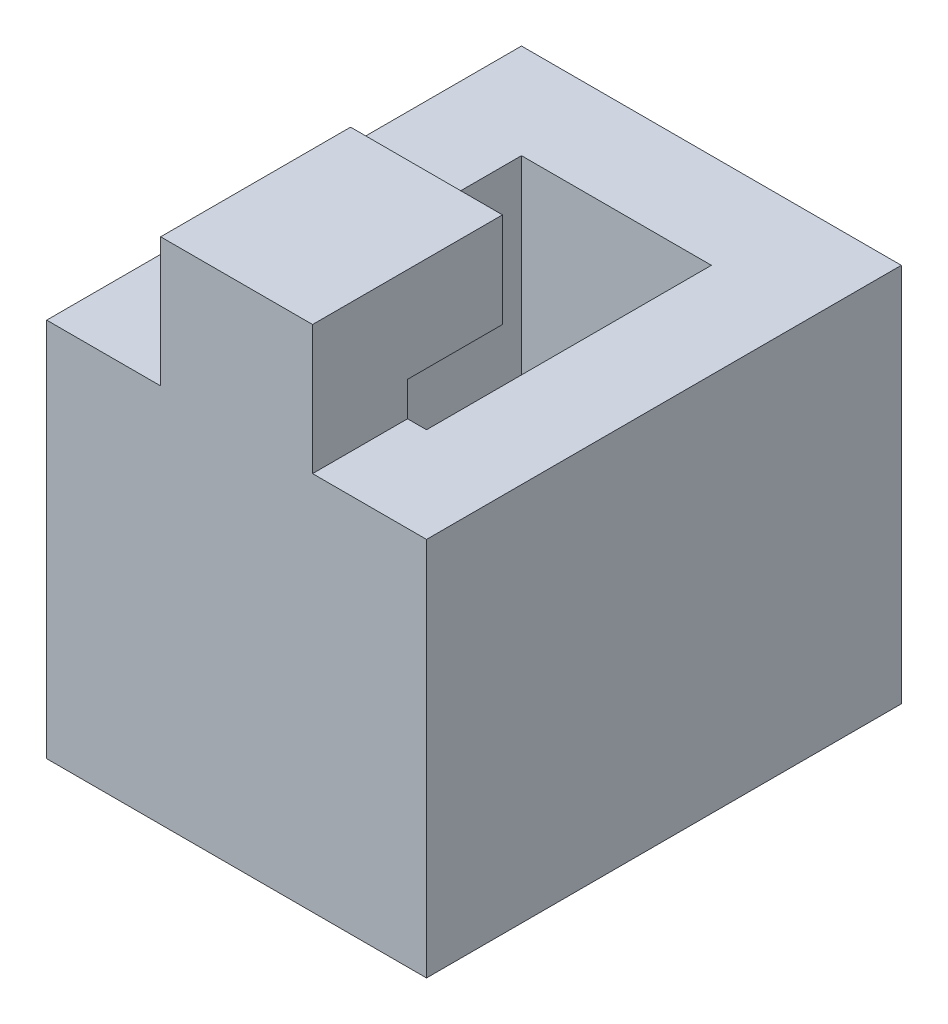
ISO-10303-21;
HEADER;
FILE_DESCRIPTION(('STEP AP214'),'2;1');
FILE_NAME('part.step','',(''),(''),'','','');
FILE_SCHEMA(('AUTOMOTIVE_DESIGN { 1 0 10303 214 1 1 1 1 }'));
ENDSEC;
DATA;
#1=APPLICATION_CONTEXT('core data for automotive mechanical design processes');
#2=APPLICATION_PROTOCOL_DEFINITION('international standard','automotive_design',2000,#1);
#3=PRODUCT_CONTEXT('',#1,'mechanical');
#4=PRODUCT('Part','Part','',(#3));
#5=PRODUCT_RELATED_PRODUCT_CATEGORY('part','',(#4));
#6=PRODUCT_DEFINITION_FORMATION('','',#4);
#7=PRODUCT_DEFINITION_CONTEXT('part definition',#1,'design');
#8=PRODUCT_DEFINITION('design','',#6,#7);
#9=PRODUCT_DEFINITION_SHAPE('','',#8);
#10=(LENGTH_UNIT() NAMED_UNIT(*) SI_UNIT(.MILLI.,.METRE.));
#11=(NAMED_UNIT(*) PLANE_ANGLE_UNIT() SI_UNIT($,.RADIAN.));
#12=(NAMED_UNIT(*) SI_UNIT($,.STERADIAN.) SOLID_ANGLE_UNIT());
#13=UNCERTAINTY_MEASURE_WITH_UNIT(LENGTH_MEASURE(1.E-05),#10,'distance_accuracy_value','');
#14=(GEOMETRIC_REPRESENTATION_CONTEXT(3) GLOBAL_UNCERTAINTY_ASSIGNED_CONTEXT((#13)) GLOBAL_UNIT_ASSIGNED_CONTEXT((#10,
#11,#12)) REPRESENTATION_CONTEXT('',''));
#15=CARTESIAN_POINT('',(0.,0.,0.));
#16=DIRECTION('',(0.,0.,1.));
#17=DIRECTION('',(1.,0.,0.));
#18=AXIS2_PLACEMENT_3D('',#15,#16,#17);
#19=CARTESIAN_POINT('',(0.,0.,5.));
#20=DIRECTION('',(0.,0.,1.));
#21=DIRECTION('',(1.,0.,0.));
#22=AXIS2_PLACEMENT_3D('',#19,#20,#21);
#23=PLANE('',#22);
#24=DIRECTION('',(0.,1.,0.));
#25=VECTOR('',#24,1.);
#26=CARTESIAN_POINT('',(-5.,0.,5.));
#27=LINE('',#26,#25);
#28=CARTESIAN_POINT('',(-5.,-10.,5.));
#29=VERTEX_POINT('',#28);
#30=CARTESIAN_POINT('',(-5.,10.,5.));
#31=VERTEX_POINT('',#30);
#32=EDGE_CURVE('E246',#29,#31,#27,.T.);
#33=ORIENTED_EDGE('',*,*,#32,.F.);
#34=DIRECTION('',(1.,0.,0.));
#35=VECTOR('',#34,1.);
#36=CARTESIAN_POINT('',(0.,-10.,5.));
#37=LINE('',#36,#35);
#38=CARTESIAN_POINT('',(5.,-10.,5.));
#39=VERTEX_POINT('',#38);
#40=EDGE_CURVE('E276',#29,#39,#37,.T.);
#41=ORIENTED_EDGE('',*,*,#40,.T.);
#42=DIRECTION('',(0.,1.,0.));
#43=VECTOR('',#42,1.);
#44=CARTESIAN_POINT('',(5.,0.,5.));
#45=LINE('',#44,#43);
#46=CARTESIAN_POINT('',(5.,10.,5.));
#47=VERTEX_POINT('',#46);
#48=EDGE_CURVE('E233',#39,#47,#45,.T.);
#49=ORIENTED_EDGE('',*,*,#48,.T.);
#50=DIRECTION('',(1.,0.,0.));
#51=VECTOR('',#50,1.);
#52=CARTESIAN_POINT('',(0.,10.,5.));
#53=LINE('',#52,#51);
#54=EDGE_CURVE('E280',#31,#47,#53,.T.);
#55=ORIENTED_EDGE('',*,*,#54,.F.);
#56=EDGE_LOOP('',(#33,#41,#49,#55));
#57=FACE_BOUND('',#56,.T.);
#58=CARTESIAN_POINT('',(0.,0.,5.));
#59=DIRECTION('',(0.,0.,1.));
#60=DIRECTION('',(1.,0.,0.));
#61=AXIS2_PLACEMENT_3D('',#58,#59,#60);
#62=CIRCLE('',#61,2.65429999999998);
#63=CARTESIAN_POINT('',(2.65429999999998,0.,5.));
#64=VERTEX_POINT('',#63);
#65=EDGE_CURVE('E254',#64,#64,#62,.T.);
#66=ORIENTED_EDGE('',*,*,#65,.F.);
#67=EDGE_LOOP('',(#66));
#68=FACE_BOUND('',#67,.T.);
#69=ADVANCED_FACE('F47',(#57,#68),#23,.T.);
#70=CARTESIAN_POINT('',(0.,-10.,5.));
#71=DIRECTION('',(0.,1.,0.));
#72=DIRECTION('',(0.,0.,1.));
#73=AXIS2_PLACEMENT_3D('',#70,#71,#72);
#74=PLANE('',#73);
#75=DIRECTION('',(1.,0.,0.));
#76=VECTOR('',#75,1.);
#77=CARTESIAN_POINT('',(0.,-10.,20.));
#78=LINE('',#77,#76);
#79=CARTESIAN_POINT('',(-5.,-10.,20.));
#80=VERTEX_POINT('',#79);
#81=CARTESIAN_POINT('',(5.,-10.,20.));
#82=VERTEX_POINT('',#81);
#83=EDGE_CURVE('E238',#80,#82,#78,.T.);
#84=ORIENTED_EDGE('',*,*,#83,.T.);
#85=DIRECTION('',(0.,0.,-1.));
#86=VECTOR('',#85,1.);
#87=CARTESIAN_POINT('',(5.,-10.,20.));
#88=LINE('',#87,#86);
#89=EDGE_CURVE('E261',#82,#39,#88,.T.);
#90=ORIENTED_EDGE('',*,*,#89,.T.);
#91=ORIENTED_EDGE('',*,*,#40,.F.);
#92=DIRECTION('',(0.,0.,-1.));
#93=VECTOR('',#92,1.);
#94=CARTESIAN_POINT('',(-5.,-10.,20.));
#95=LINE('',#94,#93);
#96=EDGE_CURVE('E250',#80,#29,#95,.T.);
#97=ORIENTED_EDGE('',*,*,#96,.F.);
#98=EDGE_LOOP('',(#84,#90,#91,#97));
#99=FACE_BOUND('',#98,.T.);
#100=DIRECTION('',(1.,0.,0.));
#101=VECTOR('',#100,1.);
#102=CARTESIAN_POINT('',(0.,-10.,0.));
#103=LINE('',#102,#101);
#104=CARTESIAN_POINT('',(-10.,-10.,0.));
#105=VERTEX_POINT('',#104);
#106=CARTESIAN_POINT('',(10.,-10.,0.));
#107=VERTEX_POINT('',#106);
#108=EDGE_CURVE('E275',#105,#107,#103,.T.);
#109=ORIENTED_EDGE('',*,*,#108,.T.);
#110=DIRECTION('',(0.,0.,-1.));
#111=VECTOR('',#110,1.);
#112=CARTESIAN_POINT('',(10.,-10.,5.));
#113=LINE('',#112,#111);
#114=CARTESIAN_POINT('',(10.,-10.,25.));
#115=VERTEX_POINT('',#114);
#116=EDGE_CURVE('E11',#115,#107,#113,.T.);
#117=ORIENTED_EDGE('',*,*,#116,.F.);
#118=DIRECTION('',(1.,0.,0.));
#119=VECTOR('',#118,1.);
#120=CARTESIAN_POINT('',(0.,-10.,25.));
#121=LINE('',#120,#119);
#122=CARTESIAN_POINT('',(-10.,-10.,25.));
#123=VERTEX_POINT('',#122);
#124=EDGE_CURVE('E225',#123,#115,#121,.T.);
#125=ORIENTED_EDGE('',*,*,#124,.F.);
#126=DIRECTION('',(0.,0.,-1.));
#127=VECTOR('',#126,1.);
#128=CARTESIAN_POINT('',(-10.,-10.,5.));
#129=LINE('',#128,#127);
#130=EDGE_CURVE('E285',#123,#105,#129,.T.);
#131=ORIENTED_EDGE('',*,*,#130,.T.);
#132=EDGE_LOOP('',(#109,#117,#125,#131));
#133=FACE_BOUND('',#132,.T.);
#134=ADVANCED_FACE('F49',(#99,#133),#74,.F.);
#135=CARTESIAN_POINT('',(10.,0.,5.));
#136=DIRECTION('',(1.,0.,0.));
#137=DIRECTION('',(0.,1.,0.));
#138=AXIS2_PLACEMENT_3D('',#135,#136,#137);
#139=PLANE('',#138);
#140=DIRECTION('',(0.,-1.,0.));
#141=VECTOR('',#140,1.);
#142=CARTESIAN_POINT('',(10.,0.,0.));
#143=LINE('',#142,#141);
#144=CARTESIAN_POINT('',(10.,10.,0.));
#145=VERTEX_POINT('',#144);
#146=EDGE_CURVE('E289',#145,#107,#143,.T.);
#147=ORIENTED_EDGE('',*,*,#146,.F.);
#148=DIRECTION('',(0.,0.,-1.));
#149=VECTOR('',#148,1.);
#150=CARTESIAN_POINT('',(10.,10.,5.));
#151=LINE('',#150,#149);
#152=CARTESIAN_POINT('',(10.,10.,25.));
#153=VERTEX_POINT('',#152);
#154=EDGE_CURVE('E56',#153,#145,#151,.T.);
#155=ORIENTED_EDGE('',*,*,#154,.F.);
#156=DIRECTION('',(0.,-1.,0.));
#157=VECTOR('',#156,1.);
#158=CARTESIAN_POINT('',(10.,0.,25.));
#159=LINE('',#158,#157);
#160=EDGE_CURVE('E220',#153,#115,#159,.T.);
#161=ORIENTED_EDGE('',*,*,#160,.T.);
#162=ORIENTED_EDGE('',*,*,#116,.T.);
#163=EDGE_LOOP('',(#147,#155,#161,#162));
#164=FACE_BOUND('',#163,.T.);
#165=ADVANCED_FACE('F314',(#164),#139,.T.);
#166=CARTESIAN_POINT('',(0.,10.,5.));
#167=DIRECTION('',(0.,1.,0.));
#168=DIRECTION('',(0.,0.,1.));
#169=AXIS2_PLACEMENT_3D('',#166,#167,#168);
#170=PLANE('',#169);
#171=DIRECTION('',(0.,0.,1.));
#172=VECTOR('',#171,1.);
#173=CARTESIAN_POINT('',(-4.,10.,20.));
#174=LINE('',#173,#172);
#175=CARTESIAN_POINT('',(-4.,10.,20.));
#176=VERTEX_POINT('',#175);
#177=CARTESIAN_POINT('',(-4.,10.,25.));
#178=VERTEX_POINT('',#177);
#179=EDGE_CURVE('E204',#176,#178,#174,.T.);
#180=ORIENTED_EDGE('',*,*,#179,.F.);
#181=DIRECTION('',(1.,0.,0.));
#182=VECTOR('',#181,1.);
#183=CARTESIAN_POINT('',(0.,10.,20.));
#184=LINE('',#183,#182);
#185=CARTESIAN_POINT('',(-5.,10.,20.));
#186=VERTEX_POINT('',#185);
#187=EDGE_CURVE('E234',#186,#176,#184,.T.);
#188=ORIENTED_EDGE('',*,*,#187,.F.);
#189=DIRECTION('',(0.,0.,-1.));
#190=VECTOR('',#189,1.);
#191=CARTESIAN_POINT('',(-5.,10.,20.));
#192=LINE('',#191,#190);
#193=EDGE_CURVE('E245',#186,#31,#192,.T.);
#194=ORIENTED_EDGE('',*,*,#193,.T.);
#195=ORIENTED_EDGE('',*,*,#54,.T.);
#196=DIRECTION('',(0.,0.,-1.));
#197=VECTOR('',#196,1.);
#198=CARTESIAN_POINT('',(5.,10.,20.));
#199=LINE('',#198,#197);
#200=CARTESIAN_POINT('',(5.,10.,20.));
#201=VERTEX_POINT('',#200);
#202=EDGE_CURVE('E71',#201,#47,#199,.T.);
#203=ORIENTED_EDGE('',*,*,#202,.F.);
#204=CARTESIAN_POINT('',(4.,10.,20.));
#205=VERTEX_POINT('',#204);
#206=EDGE_CURVE('E213',#205,#201,#184,.T.);
#207=ORIENTED_EDGE('',*,*,#206,.F.);
#208=DIRECTION('',(0.,0.,1.));
#209=VECTOR('',#208,1.);
#210=CARTESIAN_POINT('',(4.,10.,20.));
#211=LINE('',#210,#209);
#212=CARTESIAN_POINT('',(4.,10.,25.));
#213=VERTEX_POINT('',#212);
#214=EDGE_CURVE('E210',#205,#213,#211,.T.);
#215=ORIENTED_EDGE('',*,*,#214,.T.);
#216=DIRECTION('',(1.,0.,0.));
#217=VECTOR('',#216,1.);
#218=CARTESIAN_POINT('',(0.,10.,25.));
#219=LINE('',#218,#217);
#220=EDGE_CURVE('E221',#213,#153,#219,.T.);
#221=ORIENTED_EDGE('',*,*,#220,.T.);
#222=ORIENTED_EDGE('',*,*,#154,.T.);
#223=DIRECTION('',(1.,0.,0.));
#224=VECTOR('',#223,1.);
#225=CARTESIAN_POINT('',(0.,10.,0.));
#226=LINE('',#225,#224);
#227=CARTESIAN_POINT('',(-10.,10.,0.));
#228=VERTEX_POINT('',#227);
#229=EDGE_CURVE('E293',#228,#145,#226,.T.);
#230=ORIENTED_EDGE('',*,*,#229,.F.);
#231=DIRECTION('',(0.,0.,-1.));
#232=VECTOR('',#231,1.);
#233=CARTESIAN_POINT('',(-10.,10.,5.));
#234=LINE('',#233,#232);
#235=CARTESIAN_POINT('',(-10.,10.,25.));
#236=VERTEX_POINT('',#235);
#237=EDGE_CURVE('E302',#236,#228,#234,.T.);
#238=ORIENTED_EDGE('',*,*,#237,.F.);
#239=EDGE_CURVE('E216',#236,#178,#219,.T.);
#240=ORIENTED_EDGE('',*,*,#239,.T.);
#241=EDGE_LOOP('',(#180,#188,#194,#195,#203,#207,#215,#221,#222,#230,#238,#240));
#242=FACE_BOUND('',#241,.T.);
#243=ADVANCED_FACE('F310',(#242),#170,.T.);
#244=CARTESIAN_POINT('',(-10.,0.,5.));
#245=DIRECTION('',(1.,0.,0.));
#246=DIRECTION('',(0.,0.,-1.));
#247=AXIS2_PLACEMENT_3D('',#244,#245,#246);
#248=PLANE('',#247);
#249=DIRECTION('',(0.,-1.,0.));
#250=VECTOR('',#249,1.);
#251=CARTESIAN_POINT('',(-10.,0.,0.));
#252=LINE('',#251,#250);
#253=EDGE_CURVE('E281',#228,#105,#252,.T.);
#254=ORIENTED_EDGE('',*,*,#253,.T.);
#255=ORIENTED_EDGE('',*,*,#130,.F.);
#256=DIRECTION('',(0.,-1.,0.));
#257=VECTOR('',#256,1.);
#258=CARTESIAN_POINT('',(-10.,0.,25.));
#259=LINE('',#258,#257);
#260=EDGE_CURVE('E229',#236,#123,#259,.T.);
#261=ORIENTED_EDGE('',*,*,#260,.F.);
#262=ORIENTED_EDGE('',*,*,#237,.T.);
#263=EDGE_LOOP('',(#254,#255,#261,#262));
#264=FACE_BOUND('',#263,.T.);
#265=ADVANCED_FACE('F320',(#264),#248,.F.);
#266=CARTESIAN_POINT('',(0.,0.,0.));
#267=DIRECTION('',(0.,0.,1.));
#268=DIRECTION('',(1.,0.,0.));
#269=AXIS2_PLACEMENT_3D('',#266,#267,#268);
#270=PLANE('',#269);
#271=CARTESIAN_POINT('',(0.,0.,0.));
#272=DIRECTION('',(0.,0.,1.));
#273=DIRECTION('',(1.,0.,0.));
#274=AXIS2_PLACEMENT_3D('',#271,#272,#273);
#275=CIRCLE('',#274,2.6543);
#276=CARTESIAN_POINT('',(2.6543,0.,0.));
#277=VERTEX_POINT('',#276);
#278=EDGE_CURVE('E271',#277,#277,#275,.T.);
#279=ORIENTED_EDGE('',*,*,#278,.T.);
#280=EDGE_LOOP('',(#279));
#281=FACE_BOUND('',#280,.T.);
#282=ORIENTED_EDGE('',*,*,#108,.F.);
#283=ORIENTED_EDGE('',*,*,#253,.F.);
#284=ORIENTED_EDGE('',*,*,#229,.T.);
#285=ORIENTED_EDGE('',*,*,#146,.T.);
#286=EDGE_LOOP('',(#282,#283,#284,#285));
#287=FACE_BOUND('',#286,.T.);
#288=ADVANCED_FACE('F318',(#281,#287),#270,.F.);
#289=CARTESIAN_POINT('',(0.,0.,5.));
#290=DIRECTION('',(0.,0.,1.));
#291=DIRECTION('',(1.,0.,0.));
#292=AXIS2_PLACEMENT_3D('',#289,#290,#291);
#293=CYLINDRICAL_SURFACE('',#292,2.65429999999999);
#294=ORIENTED_EDGE('',*,*,#278,.F.);
#295=EDGE_LOOP('',(#294));
#296=FACE_BOUND('',#295,.T.);
#297=ORIENTED_EDGE('',*,*,#65,.T.);
#298=EDGE_LOOP('',(#297));
#299=FACE_BOUND('',#298,.T.);
#300=ADVANCED_FACE('F354',(#296,#299),#293,.F.);
#301=CARTESIAN_POINT('',(5.,0.,20.));
#302=DIRECTION('',(-1.,0.,0.));
#303=DIRECTION('',(0.,-1.,0.));
#304=AXIS2_PLACEMENT_3D('',#301,#302,#303);
#305=PLANE('',#304);
#306=ORIENTED_EDGE('',*,*,#48,.F.);
#307=ORIENTED_EDGE('',*,*,#89,.F.);
#308=DIRECTION('',(0.,1.,0.));
#309=VECTOR('',#308,1.);
#310=CARTESIAN_POINT('',(5.,0.,20.));
#311=LINE('',#310,#309);
#312=EDGE_CURVE('E258',#82,#201,#311,.T.);
#313=ORIENTED_EDGE('',*,*,#312,.T.);
#314=ORIENTED_EDGE('',*,*,#202,.T.);
#315=EDGE_LOOP('',(#306,#307,#313,#314));
#316=FACE_BOUND('',#315,.T.);
#317=ADVANCED_FACE('F341',(#316),#305,.T.);
#318=CARTESIAN_POINT('',(-5.,0.,20.));
#319=DIRECTION('',(-1.,0.,0.));
#320=DIRECTION('',(0.,-1.,0.));
#321=AXIS2_PLACEMENT_3D('',#318,#319,#320);
#322=PLANE('',#321);
#323=ORIENTED_EDGE('',*,*,#32,.T.);
#324=ORIENTED_EDGE('',*,*,#193,.F.);
#325=DIRECTION('',(0.,1.,0.));
#326=VECTOR('',#325,1.);
#327=CARTESIAN_POINT('',(-5.,0.,20.));
#328=LINE('',#327,#326);
#329=EDGE_CURVE('E242',#80,#186,#328,.T.);
#330=ORIENTED_EDGE('',*,*,#329,.F.);
#331=ORIENTED_EDGE('',*,*,#96,.T.);
#332=EDGE_LOOP('',(#323,#324,#330,#331));
#333=FACE_BOUND('',#332,.T.);
#334=ADVANCED_FACE('F336',(#333),#322,.F.);
#335=CARTESIAN_POINT('',(0.,0.,20.));
#336=DIRECTION('',(0.,0.,-1.));
#337=DIRECTION('',(-1.,0.,0.));
#338=AXIS2_PLACEMENT_3D('',#335,#336,#337);
#339=PLANE('',#338);
#340=ORIENTED_EDGE('',*,*,#187,.T.);
#341=DIRECTION('',(0.,-1.,0.));
#342=VECTOR('',#341,1.);
#343=CARTESIAN_POINT('',(-4.,0.,20.));
#344=LINE('',#343,#342);
#345=CARTESIAN_POINT('',(-4.,11.8,20.));
#346=VERTEX_POINT('',#345);
#347=EDGE_CURVE('E196',#346,#176,#344,.T.);
#348=ORIENTED_EDGE('',*,*,#347,.F.);
#349=DIRECTION('',(1.,0.,0.));
#350=VECTOR('',#349,1.);
#351=CARTESIAN_POINT('',(0.,11.8,20.));
#352=LINE('',#351,#350);
#353=CARTESIAN_POINT('',(4.,11.8,20.));
#354=VERTEX_POINT('',#353);
#355=EDGE_CURVE('E156',#346,#354,#352,.T.);
#356=ORIENTED_EDGE('',*,*,#355,.T.);
#357=DIRECTION('',(0.,-1.,0.));
#358=VECTOR('',#357,1.);
#359=CARTESIAN_POINT('',(4.,0.,20.));
#360=LINE('',#359,#358);
#361=EDGE_CURVE('E199',#354,#205,#360,.T.);
#362=ORIENTED_EDGE('',*,*,#361,.T.);
#363=ORIENTED_EDGE('',*,*,#206,.T.);
#364=ORIENTED_EDGE('',*,*,#312,.F.);
#365=ORIENTED_EDGE('',*,*,#83,.F.);
#366=ORIENTED_EDGE('',*,*,#329,.T.);
#367=EDGE_LOOP('',(#340,#348,#356,#362,#363,#364,#365,#366));
#368=FACE_BOUND('',#367,.T.);
#369=ADVANCED_FACE('F331',(#368),#339,.T.);
#370=CARTESIAN_POINT('',(0.,0.,25.));
#371=DIRECTION('',(0.,0.,-1.));
#372=DIRECTION('',(-1.,0.,0.));
#373=AXIS2_PLACEMENT_3D('',#370,#371,#372);
#374=PLANE('',#373);
#375=ORIENTED_EDGE('',*,*,#239,.F.);
#376=ORIENTED_EDGE('',*,*,#260,.T.);
#377=ORIENTED_EDGE('',*,*,#124,.T.);
#378=ORIENTED_EDGE('',*,*,#160,.F.);
#379=ORIENTED_EDGE('',*,*,#220,.F.);
#380=DIRECTION('',(0.,-1.,0.));
#381=VECTOR('',#380,1.);
#382=CARTESIAN_POINT('',(4.,0.,25.));
#383=LINE('',#382,#381);
#384=CARTESIAN_POINT('',(4.,16.8,25.));
#385=VERTEX_POINT('',#384);
#386=EDGE_CURVE('E63',#385,#213,#383,.T.);
#387=ORIENTED_EDGE('',*,*,#386,.F.);
#388=DIRECTION('',(1.,0.,0.));
#389=VECTOR('',#388,1.);
#390=CARTESIAN_POINT('',(0.,16.8,25.));
#391=LINE('',#390,#389);
#392=CARTESIAN_POINT('',(-4.,16.8,25.));
#393=VERTEX_POINT('',#392);
#394=EDGE_CURVE('E178',#393,#385,#391,.T.);
#395=ORIENTED_EDGE('',*,*,#394,.F.);
#396=DIRECTION('',(0.,-1.,0.));
#397=VECTOR('',#396,1.);
#398=CARTESIAN_POINT('',(-4.,0.,25.));
#399=LINE('',#398,#397);
#400=EDGE_CURVE('E190',#393,#178,#399,.T.);
#401=ORIENTED_EDGE('',*,*,#400,.T.);
#402=EDGE_LOOP('',(#375,#376,#377,#378,#379,#387,#395,#401));
#403=FACE_BOUND('',#402,.T.);
#404=ADVANCED_FACE('F326',(#403),#374,.F.);
#405=CARTESIAN_POINT('',(-4.,0.,20.));
#406=DIRECTION('',(-1.,0.,0.));
#407=DIRECTION('',(0.,-1.,0.));
#408=AXIS2_PLACEMENT_3D('',#405,#406,#407);
#409=PLANE('',#408);
#410=ORIENTED_EDGE('',*,*,#400,.F.);
#411=DIRECTION('',(0.,0.,1.));
#412=VECTOR('',#411,1.);
#413=CARTESIAN_POINT('',(-4.,16.8,15.));
#414=LINE('',#413,#412);
#415=CARTESIAN_POINT('',(-4.,16.8,15.));
#416=VERTEX_POINT('',#415);
#417=EDGE_CURVE('E175',#416,#393,#414,.T.);
#418=ORIENTED_EDGE('',*,*,#417,.F.);
#419=DIRECTION('',(0.,-1.,0.));
#420=VECTOR('',#419,1.);
#421=CARTESIAN_POINT('',(-4.,0.,15.));
#422=LINE('',#421,#420);
#423=CARTESIAN_POINT('',(-4.,11.8,15.));
#424=VERTEX_POINT('',#423);
#425=EDGE_CURVE('E167',#416,#424,#422,.T.);
#426=ORIENTED_EDGE('',*,*,#425,.T.);
#427=DIRECTION('',(0.,0.,1.));
#428=VECTOR('',#427,1.);
#429=CARTESIAN_POINT('',(-4.,11.8,15.));
#430=LINE('',#429,#428);
#431=EDGE_CURVE('E151',#424,#346,#430,.T.);
#432=ORIENTED_EDGE('',*,*,#431,.T.);
#433=ORIENTED_EDGE('',*,*,#347,.T.);
#434=ORIENTED_EDGE('',*,*,#179,.T.);
#435=EDGE_LOOP('',(#410,#418,#426,#432,#433,#434));
#436=FACE_BOUND('',#435,.T.);
#437=ADVANCED_FACE('F173',(#436),#409,.T.);
#438=CARTESIAN_POINT('',(4.,0.,20.));
#439=DIRECTION('',(-1.,0.,0.));
#440=DIRECTION('',(0.,-1.,0.));
#441=AXIS2_PLACEMENT_3D('',#438,#439,#440);
#442=PLANE('',#441);
#443=ORIENTED_EDGE('',*,*,#386,.T.);
#444=ORIENTED_EDGE('',*,*,#214,.F.);
#445=ORIENTED_EDGE('',*,*,#361,.F.);
#446=DIRECTION('',(0.,0.,1.));
#447=VECTOR('',#446,1.);
#448=CARTESIAN_POINT('',(4.,11.8,15.));
#449=LINE('',#448,#447);
#450=CARTESIAN_POINT('',(4.,11.8,15.));
#451=VERTEX_POINT('',#450);
#452=EDGE_CURVE('E161',#451,#354,#449,.T.);
#453=ORIENTED_EDGE('',*,*,#452,.F.);
#454=DIRECTION('',(0.,-1.,0.));
#455=VECTOR('',#454,1.);
#456=CARTESIAN_POINT('',(4.,0.,15.));
#457=LINE('',#456,#455);
#458=CARTESIAN_POINT('',(4.,16.8,15.));
#459=VERTEX_POINT('',#458);
#460=EDGE_CURVE('E169',#459,#451,#457,.T.);
#461=ORIENTED_EDGE('',*,*,#460,.F.);
#462=DIRECTION('',(0.,0.,1.));
#463=VECTOR('',#462,1.);
#464=CARTESIAN_POINT('',(4.,16.8,15.));
#465=LINE('',#464,#463);
#466=EDGE_CURVE('E191',#459,#385,#465,.T.);
#467=ORIENTED_EDGE('',*,*,#466,.T.);
#468=EDGE_LOOP('',(#443,#444,#445,#453,#461,#467));
#469=FACE_BOUND('',#468,.T.);
#470=ADVANCED_FACE('F393',(#469),#442,.F.);
#471=CARTESIAN_POINT('',(0.,11.8,15.));
#472=DIRECTION('',(0.,-1.,0.));
#473=DIRECTION('',(0.,0.,-1.));
#474=AXIS2_PLACEMENT_3D('',#471,#472,#473);
#475=PLANE('',#474);
#476=ORIENTED_EDGE('',*,*,#355,.F.);
#477=ORIENTED_EDGE('',*,*,#431,.F.);
#478=DIRECTION('',(1.,0.,0.));
#479=VECTOR('',#478,1.);
#480=CARTESIAN_POINT('',(0.,11.8,15.));
#481=LINE('',#480,#479);
#482=EDGE_CURVE('E154',#424,#451,#481,.T.);
#483=ORIENTED_EDGE('',*,*,#482,.T.);
#484=ORIENTED_EDGE('',*,*,#452,.T.);
#485=EDGE_LOOP('',(#476,#477,#483,#484));
#486=FACE_BOUND('',#485,.T.);
#487=ADVANCED_FACE('F153',(#486),#475,.T.);
#488=CARTESIAN_POINT('',(0.,16.8,15.));
#489=DIRECTION('',(0.,-1.,0.));
#490=DIRECTION('',(0.,0.,-1.));
#491=AXIS2_PLACEMENT_3D('',#488,#489,#490);
#492=PLANE('',#491);
#493=ORIENTED_EDGE('',*,*,#394,.T.);
#494=ORIENTED_EDGE('',*,*,#466,.F.);
#495=DIRECTION('',(1.,0.,0.));
#496=VECTOR('',#495,1.);
#497=CARTESIAN_POINT('',(0.,16.8,15.));
#498=LINE('',#497,#496);
#499=EDGE_CURVE('E162',#416,#459,#498,.T.);
#500=ORIENTED_EDGE('',*,*,#499,.F.);
#501=ORIENTED_EDGE('',*,*,#417,.T.);
#502=EDGE_LOOP('',(#493,#494,#500,#501));
#503=FACE_BOUND('',#502,.T.);
#504=ADVANCED_FACE('F407',(#503),#492,.F.);
#505=CARTESIAN_POINT('',(0.,0.,15.));
#506=DIRECTION('',(0.,0.,1.));
#507=DIRECTION('',(1.,0.,0.));
#508=AXIS2_PLACEMENT_3D('',#505,#506,#507);
#509=PLANE('',#508);
#510=ORIENTED_EDGE('',*,*,#425,.F.);
#511=ORIENTED_EDGE('',*,*,#499,.T.);
#512=ORIENTED_EDGE('',*,*,#460,.T.);
#513=ORIENTED_EDGE('',*,*,#482,.F.);
#514=EDGE_LOOP('',(#510,#511,#512,#513));
#515=FACE_BOUND('',#514,.T.);
#516=ADVANCED_FACE('F166',(#515),#509,.F.);
#517=CLOSED_SHELL('',(#69,#134,#165,#243,#265,#288,#300,#317,#334,#369,#404,#437,#470,#487,#504,#516));
#518=MANIFOLD_SOLID_BREP('B2',#517);
#519=ADVANCED_BREP_SHAPE_REPRESENTATION('',(#18,#518),#14);
#520=SHAPE_DEFINITION_REPRESENTATION(#9,#519);
ENDSEC;
END-ISO-10303-21;
